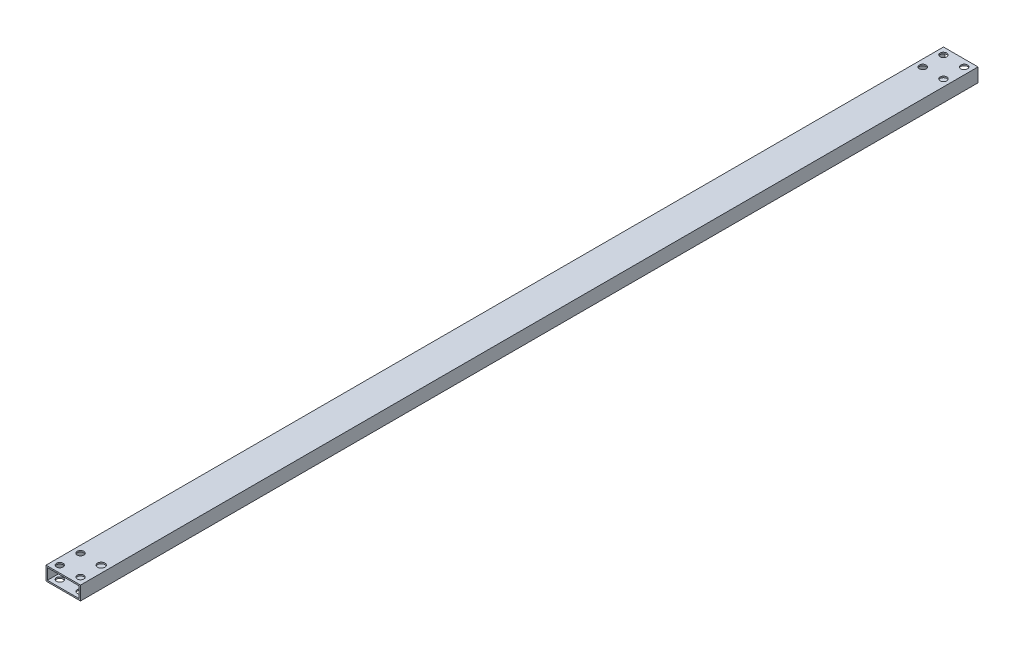
ISO-10303-21;
HEADER;
FILE_DESCRIPTION(('STEP AP214'),'2;1');
FILE_NAME('part.step','',(''),(''),'','','');
FILE_SCHEMA(('AUTOMOTIVE_DESIGN { 1 0 10303 214 1 1 1 1 }'));
ENDSEC;
DATA;
#1=APPLICATION_CONTEXT('core data for automotive mechanical design processes');
#2=APPLICATION_PROTOCOL_DEFINITION('international standard','automotive_design',2000,#1);
#3=PRODUCT_CONTEXT('',#1,'mechanical');
#4=PRODUCT('Part','Part','',(#3));
#5=PRODUCT_RELATED_PRODUCT_CATEGORY('part','',(#4));
#6=PRODUCT_DEFINITION_FORMATION('','',#4);
#7=PRODUCT_DEFINITION_CONTEXT('part definition',#1,'design');
#8=PRODUCT_DEFINITION('design','',#6,#7);
#9=PRODUCT_DEFINITION_SHAPE('','',#8);
#10=(LENGTH_UNIT() NAMED_UNIT(*) SI_UNIT(.MILLI.,.METRE.));
#11=(NAMED_UNIT(*) PLANE_ANGLE_UNIT() SI_UNIT($,.RADIAN.));
#12=(NAMED_UNIT(*) SI_UNIT($,.STERADIAN.) SOLID_ANGLE_UNIT());
#13=UNCERTAINTY_MEASURE_WITH_UNIT(LENGTH_MEASURE(1.E-05),#10,'distance_accuracy_value','');
#14=(GEOMETRIC_REPRESENTATION_CONTEXT(3) GLOBAL_UNCERTAINTY_ASSIGNED_CONTEXT((#13)) GLOBAL_UNIT_ASSIGNED_CONTEXT((#10,
#11,#12)) REPRESENTATION_CONTEXT('',''));
#15=CARTESIAN_POINT('',(0.,0.,0.));
#16=DIRECTION('',(0.,0.,1.));
#17=DIRECTION('',(1.,0.,0.));
#18=AXIS2_PLACEMENT_3D('',#15,#16,#17);
#19=CARTESIAN_POINT('',(25.,-10.,1300.));
#20=DIRECTION('',(-1.,0.,0.));
#21=DIRECTION('',(0.,0.,1.));
#22=AXIS2_PLACEMENT_3D('',#19,#20,#21);
#23=PLANE('',#22);
#24=DIRECTION('',(0.,1.,0.));
#25=VECTOR('',#24,1.);
#26=CARTESIAN_POINT('',(25.,-10.,0.));
#27=LINE('',#26,#25);
#28=CARTESIAN_POINT('',(25.,-10.,0.));
#29=VERTEX_POINT('',#28);
#30=CARTESIAN_POINT('',(25.,10.,0.));
#31=VERTEX_POINT('',#30);
#32=EDGE_CURVE('E135',#29,#31,#27,.T.);
#33=ORIENTED_EDGE('',*,*,#32,.T.);
#34=DIRECTION('',(0.,0.,-1.));
#35=VECTOR('',#34,1.);
#36=CARTESIAN_POINT('',(25.,10.,1300.));
#37=LINE('',#36,#35);
#38=CARTESIAN_POINT('',(25.,10.,1300.));
#39=VERTEX_POINT('',#38);
#40=EDGE_CURVE('E11',#39,#31,#37,.T.);
#41=ORIENTED_EDGE('',*,*,#40,.F.);
#42=DIRECTION('',(0.,1.,0.));
#43=VECTOR('',#42,1.);
#44=CARTESIAN_POINT('',(25.,-10.,1300.));
#45=LINE('',#44,#43);
#46=CARTESIAN_POINT('',(25.,-10.,1300.));
#47=VERTEX_POINT('',#46);
#48=EDGE_CURVE('E139',#47,#39,#45,.T.);
#49=ORIENTED_EDGE('',*,*,#48,.F.);
#50=DIRECTION('',(0.,0.,-1.));
#51=VECTOR('',#50,1.);
#52=CARTESIAN_POINT('',(25.,-10.,1300.));
#53=LINE('',#52,#51);
#54=EDGE_CURVE('E149',#47,#29,#53,.T.);
#55=ORIENTED_EDGE('',*,*,#54,.T.);
#56=EDGE_LOOP('',(#33,#41,#49,#55));
#57=FACE_BOUND('',#56,.T.);
#58=ADVANCED_FACE('F33',(#57),#23,.F.);
#59=CARTESIAN_POINT('',(-25.,10.,1300.));
#60=DIRECTION('',(0.,-1.,0.));
#61=DIRECTION('',(0.,0.,-1.));
#62=AXIS2_PLACEMENT_3D('',#59,#60,#61);
#63=PLANE('',#62);
#64=CARTESIAN_POINT('',(15.,10.,1290.));
#65=DIRECTION('',(0.,1.,0.));
#66=DIRECTION('',(0.,0.,1.));
#67=AXIS2_PLACEMENT_3D('',#64,#65,#66);
#68=CIRCLE('',#67,4.80233269000457);
#69=CARTESIAN_POINT('',(15.,10.,1294.80233269));
#70=VERTEX_POINT('',#69);
#71=EDGE_CURVE('E513',#70,#70,#68,.T.);
#72=ORIENTED_EDGE('',*,*,#71,.F.);
#73=EDGE_LOOP('',(#72));
#74=FACE_BOUND('',#73,.T.);
#75=CARTESIAN_POINT('',(-15.0000000000001,10.,1290.));
#76=DIRECTION('',(0.,1.,0.));
#77=DIRECTION('',(0.,0.,1.));
#78=AXIS2_PLACEMENT_3D('',#75,#76,#77);
#79=CIRCLE('',#78,4.78719116511338);
#80=CARTESIAN_POINT('',(-15.0000000000001,10.,1294.78719116511));
#81=VERTEX_POINT('',#80);
#82=EDGE_CURVE('E202',#81,#81,#79,.T.);
#83=ORIENTED_EDGE('',*,*,#82,.F.);
#84=EDGE_LOOP('',(#83));
#85=FACE_BOUND('',#84,.T.);
#86=CARTESIAN_POINT('',(-15.,10.,1260.));
#87=DIRECTION('',(0.,1.,0.));
#88=DIRECTION('',(0.,0.,1.));
#89=AXIS2_PLACEMENT_3D('',#86,#87,#88);
#90=CIRCLE('',#89,4.87079540304988);
#91=CARTESIAN_POINT('',(-15.,10.,1264.87079540305));
#92=VERTEX_POINT('',#91);
#93=EDGE_CURVE('E199',#92,#92,#90,.T.);
#94=ORIENTED_EDGE('',*,*,#93,.F.);
#95=EDGE_LOOP('',(#94));
#96=FACE_BOUND('',#95,.T.);
#97=CARTESIAN_POINT('',(14.9999999999999,10.,1260.));
#98=DIRECTION('',(0.,1.,0.));
#99=DIRECTION('',(0.,0.,1.));
#100=AXIS2_PLACEMENT_3D('',#97,#98,#99);
#101=CIRCLE('',#100,5.29030637475296);
#102=CARTESIAN_POINT('',(14.9999999999999,10.,1265.29030637475));
#103=VERTEX_POINT('',#102);
#104=EDGE_CURVE('E218',#103,#103,#101,.T.);
#105=ORIENTED_EDGE('',*,*,#104,.F.);
#106=EDGE_LOOP('',(#105));
#107=FACE_BOUND('',#106,.T.);
#108=CARTESIAN_POINT('',(-15.,10.,40.));
#109=DIRECTION('',(0.,1.,0.));
#110=DIRECTION('',(0.,0.,1.));
#111=AXIS2_PLACEMENT_3D('',#108,#109,#110);
#112=CIRCLE('',#111,4.87079540304988);
#113=CARTESIAN_POINT('',(-15.,10.,44.8707954030499));
#114=VERTEX_POINT('',#113);
#115=EDGE_CURVE('E225',#114,#114,#112,.T.);
#116=ORIENTED_EDGE('',*,*,#115,.F.);
#117=EDGE_LOOP('',(#116));
#118=FACE_BOUND('',#117,.T.);
#119=CARTESIAN_POINT('',(15.,10.,40.));
#120=DIRECTION('',(0.,1.,0.));
#121=DIRECTION('',(0.,0.,1.));
#122=AXIS2_PLACEMENT_3D('',#119,#120,#121);
#123=CIRCLE('',#122,4.87079540304988);
#124=CARTESIAN_POINT('',(15.,10.,44.8707954030499));
#125=VERTEX_POINT('',#124);
#126=EDGE_CURVE('E232',#125,#125,#123,.T.);
#127=ORIENTED_EDGE('',*,*,#126,.F.);
#128=EDGE_LOOP('',(#127));
#129=FACE_BOUND('',#128,.T.);
#130=CARTESIAN_POINT('',(15.,10.,10.));
#131=DIRECTION('',(0.,1.,0.));
#132=DIRECTION('',(0.,0.,1.));
#133=AXIS2_PLACEMENT_3D('',#130,#131,#132);
#134=CIRCLE('',#133,4.87079540304988);
#135=CARTESIAN_POINT('',(15.,10.,14.8707954030499));
#136=VERTEX_POINT('',#135);
#137=EDGE_CURVE('E239',#136,#136,#134,.T.);
#138=ORIENTED_EDGE('',*,*,#137,.F.);
#139=EDGE_LOOP('',(#138));
#140=FACE_BOUND('',#139,.T.);
#141=CARTESIAN_POINT('',(-15.,10.,10.));
#142=DIRECTION('',(0.,1.,0.));
#143=DIRECTION('',(0.,0.,1.));
#144=AXIS2_PLACEMENT_3D('',#141,#142,#143);
#145=CIRCLE('',#144,4.87079540304988);
#146=CARTESIAN_POINT('',(-15.,10.,14.8707954030499));
#147=VERTEX_POINT('',#146);
#148=EDGE_CURVE('E246',#147,#147,#145,.T.);
#149=ORIENTED_EDGE('',*,*,#148,.F.);
#150=EDGE_LOOP('',(#149));
#151=FACE_BOUND('',#150,.T.);
#152=DIRECTION('',(-1.,0.,0.));
#153=VECTOR('',#152,1.);
#154=CARTESIAN_POINT('',(-25.,10.,0.));
#155=LINE('',#154,#153);
#156=CARTESIAN_POINT('',(-25.,10.,0.));
#157=VERTEX_POINT('',#156);
#158=EDGE_CURVE('E152',#31,#157,#155,.T.);
#159=ORIENTED_EDGE('',*,*,#158,.T.);
#160=DIRECTION('',(0.,0.,-1.));
#161=VECTOR('',#160,1.);
#162=CARTESIAN_POINT('',(-25.,10.,1300.));
#163=LINE('',#162,#161);
#164=CARTESIAN_POINT('',(-25.,10.,1300.));
#165=VERTEX_POINT('',#164);
#166=EDGE_CURVE('E41',#165,#157,#163,.T.);
#167=ORIENTED_EDGE('',*,*,#166,.F.);
#168=DIRECTION('',(-1.,0.,0.));
#169=VECTOR('',#168,1.);
#170=CARTESIAN_POINT('',(-25.,10.,1300.));
#171=LINE('',#170,#169);
#172=EDGE_CURVE('E142',#39,#165,#171,.T.);
#173=ORIENTED_EDGE('',*,*,#172,.F.);
#174=ORIENTED_EDGE('',*,*,#40,.T.);
#175=EDGE_LOOP('',(#159,#167,#173,#174));
#176=FACE_BOUND('',#175,.T.);
#177=ADVANCED_FACE('F254',(#74,#85,#96,#107,#118,#129,#140,#151,#176),#63,.F.);
#178=CARTESIAN_POINT('',(-25.,-10.,1300.));
#179=DIRECTION('',(1.,0.,0.));
#180=DIRECTION('',(0.,0.,-1.));
#181=AXIS2_PLACEMENT_3D('',#178,#179,#180);
#182=PLANE('',#181);
#183=DIRECTION('',(0.,-1.,0.));
#184=VECTOR('',#183,1.);
#185=CARTESIAN_POINT('',(-25.,-10.,0.));
#186=LINE('',#185,#184);
#187=CARTESIAN_POINT('',(-25.,-10.,0.));
#188=VERTEX_POINT('',#187);
#189=EDGE_CURVE('E154',#157,#188,#186,.T.);
#190=ORIENTED_EDGE('',*,*,#189,.T.);
#191=DIRECTION('',(0.,0.,-1.));
#192=VECTOR('',#191,1.);
#193=CARTESIAN_POINT('',(-25.,-10.,1300.));
#194=LINE('',#193,#192);
#195=CARTESIAN_POINT('',(-25.,-10.,1300.));
#196=VERTEX_POINT('',#195);
#197=EDGE_CURVE('E159',#196,#188,#194,.T.);
#198=ORIENTED_EDGE('',*,*,#197,.F.);
#199=DIRECTION('',(0.,-1.,0.));
#200=VECTOR('',#199,1.);
#201=CARTESIAN_POINT('',(-25.,-10.,1300.));
#202=LINE('',#201,#200);
#203=EDGE_CURVE('E145',#165,#196,#202,.T.);
#204=ORIENTED_EDGE('',*,*,#203,.F.);
#205=ORIENTED_EDGE('',*,*,#166,.T.);
#206=EDGE_LOOP('',(#190,#198,#204,#205));
#207=FACE_BOUND('',#206,.T.);
#208=ADVANCED_FACE('F257',(#207),#182,.F.);
#209=CARTESIAN_POINT('',(-25.,-10.,1300.));
#210=DIRECTION('',(0.,1.,0.));
#211=DIRECTION('',(0.,0.,1.));
#212=AXIS2_PLACEMENT_3D('',#209,#210,#211);
#213=PLANE('',#212);
#214=CARTESIAN_POINT('',(15.,-10.,1290.));
#215=DIRECTION('',(0.,1.,0.));
#216=DIRECTION('',(0.,0.,1.));
#217=AXIS2_PLACEMENT_3D('',#214,#215,#216);
#218=CIRCLE('',#217,4.80233269000457);
#219=CARTESIAN_POINT('',(15.,-10.,1294.80233269));
#220=VERTEX_POINT('',#219);
#221=EDGE_CURVE('E508',#220,#220,#218,.T.);
#222=ORIENTED_EDGE('',*,*,#221,.T.);
#223=EDGE_LOOP('',(#222));
#224=FACE_BOUND('',#223,.T.);
#225=CARTESIAN_POINT('',(-15.0000000000001,-10.,1290.));
#226=DIRECTION('',(0.,1.,0.));
#227=DIRECTION('',(0.,0.,1.));
#228=AXIS2_PLACEMENT_3D('',#225,#226,#227);
#229=CIRCLE('',#228,4.78719116511338);
#230=CARTESIAN_POINT('',(-15.0000000000001,-10.,1294.78719116511));
#231=VERTEX_POINT('',#230);
#232=EDGE_CURVE('E195',#231,#231,#229,.T.);
#233=ORIENTED_EDGE('',*,*,#232,.T.);
#234=EDGE_LOOP('',(#233));
#235=FACE_BOUND('',#234,.T.);
#236=CARTESIAN_POINT('',(-15.,-10.,1260.));
#237=DIRECTION('',(0.,1.,0.));
#238=DIRECTION('',(0.,0.,1.));
#239=AXIS2_PLACEMENT_3D('',#236,#237,#238);
#240=CIRCLE('',#239,4.87079540304988);
#241=CARTESIAN_POINT('',(-15.,-10.,1264.87079540305));
#242=VERTEX_POINT('',#241);
#243=EDGE_CURVE('E191',#242,#242,#240,.T.);
#244=ORIENTED_EDGE('',*,*,#243,.T.);
#245=EDGE_LOOP('',(#244));
#246=FACE_BOUND('',#245,.T.);
#247=CARTESIAN_POINT('',(14.9999999999999,-10.,1260.));
#248=DIRECTION('',(0.,1.,0.));
#249=DIRECTION('',(0.,0.,1.));
#250=AXIS2_PLACEMENT_3D('',#247,#248,#249);
#251=CIRCLE('',#250,5.29030637475296);
#252=CARTESIAN_POINT('',(14.9999999999999,-10.,1265.29030637475));
#253=VERTEX_POINT('',#252);
#254=EDGE_CURVE('E187',#253,#253,#251,.T.);
#255=ORIENTED_EDGE('',*,*,#254,.T.);
#256=EDGE_LOOP('',(#255));
#257=FACE_BOUND('',#256,.T.);
#258=CARTESIAN_POINT('',(-15.,-10.,40.));
#259=DIRECTION('',(0.,1.,0.));
#260=DIRECTION('',(0.,0.,1.));
#261=AXIS2_PLACEMENT_3D('',#258,#259,#260);
#262=CIRCLE('',#261,4.87079540304988);
#263=CARTESIAN_POINT('',(-15.,-10.,44.8707954030499));
#264=VERTEX_POINT('',#263);
#265=EDGE_CURVE('E182',#264,#264,#262,.T.);
#266=ORIENTED_EDGE('',*,*,#265,.T.);
#267=EDGE_LOOP('',(#266));
#268=FACE_BOUND('',#267,.T.);
#269=CARTESIAN_POINT('',(15.,-10.,40.));
#270=DIRECTION('',(0.,1.,0.));
#271=DIRECTION('',(0.,0.,1.));
#272=AXIS2_PLACEMENT_3D('',#269,#270,#271);
#273=CIRCLE('',#272,4.87079540304988);
#274=CARTESIAN_POINT('',(15.,-10.,44.8707954030499));
#275=VERTEX_POINT('',#274);
#276=EDGE_CURVE('E177',#275,#275,#273,.T.);
#277=ORIENTED_EDGE('',*,*,#276,.T.);
#278=EDGE_LOOP('',(#277));
#279=FACE_BOUND('',#278,.T.);
#280=CARTESIAN_POINT('',(15.,-10.,10.));
#281=DIRECTION('',(0.,1.,0.));
#282=DIRECTION('',(0.,0.,1.));
#283=AXIS2_PLACEMENT_3D('',#280,#281,#282);
#284=CIRCLE('',#283,4.87079540304988);
#285=CARTESIAN_POINT('',(15.,-10.,14.8707954030499));
#286=VERTEX_POINT('',#285);
#287=EDGE_CURVE('E172',#286,#286,#284,.T.);
#288=ORIENTED_EDGE('',*,*,#287,.T.);
#289=EDGE_LOOP('',(#288));
#290=FACE_BOUND('',#289,.T.);
#291=CARTESIAN_POINT('',(-15.,-10.,10.));
#292=DIRECTION('',(0.,1.,0.));
#293=DIRECTION('',(0.,0.,1.));
#294=AXIS2_PLACEMENT_3D('',#291,#292,#293);
#295=CIRCLE('',#294,4.87079540304988);
#296=CARTESIAN_POINT('',(-15.,-10.,14.8707954030499));
#297=VERTEX_POINT('',#296);
#298=EDGE_CURVE('E167',#297,#297,#295,.T.);
#299=ORIENTED_EDGE('',*,*,#298,.T.);
#300=EDGE_LOOP('',(#299));
#301=FACE_BOUND('',#300,.T.);
#302=DIRECTION('',(1.,0.,0.));
#303=VECTOR('',#302,1.);
#304=CARTESIAN_POINT('',(-25.,-10.,0.));
#305=LINE('',#304,#303);
#306=EDGE_CURVE('E143',#188,#29,#305,.T.);
#307=ORIENTED_EDGE('',*,*,#306,.T.);
#308=ORIENTED_EDGE('',*,*,#54,.F.);
#309=DIRECTION('',(1.,0.,0.));
#310=VECTOR('',#309,1.);
#311=CARTESIAN_POINT('',(-25.,-10.,1300.));
#312=LINE('',#311,#310);
#313=EDGE_CURVE('E147',#196,#47,#312,.T.);
#314=ORIENTED_EDGE('',*,*,#313,.F.);
#315=ORIENTED_EDGE('',*,*,#197,.T.);
#316=EDGE_LOOP('',(#307,#308,#314,#315));
#317=FACE_BOUND('',#316,.T.);
#318=ADVANCED_FACE('F269',(#224,#235,#246,#257,#268,#279,#290,#301,#317),#213,.F.);
#319=CARTESIAN_POINT('',(25.,10.,1300.));
#320=DIRECTION('',(0.,0.,-1.));
#321=DIRECTION('',(-1.,0.,0.));
#322=AXIS2_PLACEMENT_3D('',#319,#320,#321);
#323=PLANE('',#322);
#324=DIRECTION('',(-1.,0.,0.));
#325=VECTOR('',#324,1.);
#326=CARTESIAN_POINT('',(-23.,8.,1300.));
#327=LINE('',#326,#325);
#328=CARTESIAN_POINT('',(23.,8.,1300.));
#329=VERTEX_POINT('',#328);
#330=CARTESIAN_POINT('',(-23.,8.,1300.));
#331=VERTEX_POINT('',#330);
#332=EDGE_CURVE('E129',#329,#331,#327,.T.);
#333=ORIENTED_EDGE('',*,*,#332,.F.);
#334=DIRECTION('',(0.,1.,0.));
#335=VECTOR('',#334,1.);
#336=CARTESIAN_POINT('',(23.,-8.,1300.));
#337=LINE('',#336,#335);
#338=CARTESIAN_POINT('',(23.,-8.,1300.));
#339=VERTEX_POINT('',#338);
#340=EDGE_CURVE('E49',#339,#329,#337,.T.);
#341=ORIENTED_EDGE('',*,*,#340,.F.);
#342=DIRECTION('',(1.,0.,0.));
#343=VECTOR('',#342,1.);
#344=CARTESIAN_POINT('',(-23.,-8.,1300.));
#345=LINE('',#344,#343);
#346=CARTESIAN_POINT('',(-23.,-8.,1300.));
#347=VERTEX_POINT('',#346);
#348=EDGE_CURVE('E117',#347,#339,#345,.T.);
#349=ORIENTED_EDGE('',*,*,#348,.F.);
#350=DIRECTION('',(0.,-1.,0.));
#351=VECTOR('',#350,1.);
#352=CARTESIAN_POINT('',(-23.,-8.,1300.));
#353=LINE('',#352,#351);
#354=EDGE_CURVE('E120',#331,#347,#353,.T.);
#355=ORIENTED_EDGE('',*,*,#354,.F.);
#356=EDGE_LOOP('',(#333,#341,#349,#355));
#357=FACE_BOUND('',#356,.T.);
#358=ORIENTED_EDGE('',*,*,#48,.T.);
#359=ORIENTED_EDGE('',*,*,#172,.T.);
#360=ORIENTED_EDGE('',*,*,#203,.T.);
#361=ORIENTED_EDGE('',*,*,#313,.T.);
#362=EDGE_LOOP('',(#358,#359,#360,#361));
#363=FACE_BOUND('',#362,.T.);
#364=ADVANCED_FACE('F274',(#357,#363),#323,.F.);
#365=CARTESIAN_POINT('',(25.,10.,0.));
#366=DIRECTION('',(0.,0.,-1.));
#367=DIRECTION('',(-1.,0.,0.));
#368=AXIS2_PLACEMENT_3D('',#365,#366,#367);
#369=PLANE('',#368);
#370=DIRECTION('',(0.,1.,0.));
#371=VECTOR('',#370,1.);
#372=CARTESIAN_POINT('',(23.,-8.,0.));
#373=LINE('',#372,#371);
#374=CARTESIAN_POINT('',(23.,-8.,0.));
#375=VERTEX_POINT('',#374);
#376=CARTESIAN_POINT('',(23.,8.,0.));
#377=VERTEX_POINT('',#376);
#378=EDGE_CURVE('E101',#375,#377,#373,.T.);
#379=ORIENTED_EDGE('',*,*,#378,.T.);
#380=DIRECTION('',(-1.,0.,0.));
#381=VECTOR('',#380,1.);
#382=CARTESIAN_POINT('',(-23.,8.,0.));
#383=LINE('',#382,#381);
#384=CARTESIAN_POINT('',(-23.,8.,0.));
#385=VERTEX_POINT('',#384);
#386=EDGE_CURVE('E110',#377,#385,#383,.T.);
#387=ORIENTED_EDGE('',*,*,#386,.T.);
#388=DIRECTION('',(0.,-1.,0.));
#389=VECTOR('',#388,1.);
#390=CARTESIAN_POINT('',(-23.,-8.,0.));
#391=LINE('',#390,#389);
#392=CARTESIAN_POINT('',(-23.,-8.,0.));
#393=VERTEX_POINT('',#392);
#394=EDGE_CURVE('E57',#385,#393,#391,.T.);
#395=ORIENTED_EDGE('',*,*,#394,.T.);
#396=DIRECTION('',(1.,0.,0.));
#397=VECTOR('',#396,1.);
#398=CARTESIAN_POINT('',(-23.,-8.,0.));
#399=LINE('',#398,#397);
#400=EDGE_CURVE('E107',#393,#375,#399,.T.);
#401=ORIENTED_EDGE('',*,*,#400,.T.);
#402=EDGE_LOOP('',(#379,#387,#395,#401));
#403=FACE_BOUND('',#402,.T.);
#404=ORIENTED_EDGE('',*,*,#32,.F.);
#405=ORIENTED_EDGE('',*,*,#306,.F.);
#406=ORIENTED_EDGE('',*,*,#189,.F.);
#407=ORIENTED_EDGE('',*,*,#158,.F.);
#408=EDGE_LOOP('',(#404,#405,#406,#407));
#409=FACE_BOUND('',#408,.T.);
#410=ADVANCED_FACE('F114',(#403,#409),#369,.T.);
#411=CARTESIAN_POINT('',(23.,-8.,0.));
#412=DIRECTION('',(1.,0.,0.));
#413=DIRECTION('',(0.,0.,-1.));
#414=AXIS2_PLACEMENT_3D('',#411,#412,#413);
#415=PLANE('',#414);
#416=ORIENTED_EDGE('',*,*,#340,.T.);
#417=DIRECTION('',(0.,0.,1.));
#418=VECTOR('',#417,1.);
#419=CARTESIAN_POINT('',(23.,8.,0.));
#420=LINE('',#419,#418);
#421=EDGE_CURVE('E97',#377,#329,#420,.T.);
#422=ORIENTED_EDGE('',*,*,#421,.F.);
#423=ORIENTED_EDGE('',*,*,#378,.F.);
#424=DIRECTION('',(0.,0.,1.));
#425=VECTOR('',#424,1.);
#426=CARTESIAN_POINT('',(23.,-8.,0.));
#427=LINE('',#426,#425);
#428=EDGE_CURVE('E133',#375,#339,#427,.T.);
#429=ORIENTED_EDGE('',*,*,#428,.T.);
#430=EDGE_LOOP('',(#416,#422,#423,#429));
#431=FACE_BOUND('',#430,.T.);
#432=ADVANCED_FACE('F99',(#431),#415,.F.);
#433=CARTESIAN_POINT('',(-23.,-8.,0.));
#434=DIRECTION('',(0.,-1.,0.));
#435=DIRECTION('',(0.,0.,-1.));
#436=AXIS2_PLACEMENT_3D('',#433,#434,#435);
#437=PLANE('',#436);
#438=CARTESIAN_POINT('',(15.,-8.,1290.));
#439=DIRECTION('',(0.,-1.,0.));
#440=DIRECTION('',(0.,0.,-1.));
#441=AXIS2_PLACEMENT_3D('',#438,#439,#440);
#442=CIRCLE('',#441,4.80233269000457);
#443=CARTESIAN_POINT('',(15.,-8.,1285.19766731));
#444=VERTEX_POINT('',#443);
#445=EDGE_CURVE('E207',#444,#444,#442,.T.);
#446=ORIENTED_EDGE('',*,*,#445,.T.);
#447=EDGE_LOOP('',(#446));
#448=FACE_BOUND('',#447,.T.);
#449=CARTESIAN_POINT('',(-15.0000000000001,-8.,1290.));
#450=DIRECTION('',(0.,-1.,0.));
#451=DIRECTION('',(0.,0.,-1.));
#452=AXIS2_PLACEMENT_3D('',#449,#450,#451);
#453=CIRCLE('',#452,4.78719116511338);
#454=CARTESIAN_POINT('',(-15.0000000000001,-8.,1285.21280883489));
#455=VERTEX_POINT('',#454);
#456=EDGE_CURVE('E194',#455,#455,#453,.T.);
#457=ORIENTED_EDGE('',*,*,#456,.T.);
#458=EDGE_LOOP('',(#457));
#459=FACE_BOUND('',#458,.T.);
#460=CARTESIAN_POINT('',(-15.,-8.,1260.));
#461=DIRECTION('',(0.,-1.,0.));
#462=DIRECTION('',(0.,0.,-1.));
#463=AXIS2_PLACEMENT_3D('',#460,#461,#462);
#464=CIRCLE('',#463,4.87079540304988);
#465=CARTESIAN_POINT('',(-15.,-8.,1255.12920459695));
#466=VERTEX_POINT('',#465);
#467=EDGE_CURVE('E190',#466,#466,#464,.T.);
#468=ORIENTED_EDGE('',*,*,#467,.T.);
#469=EDGE_LOOP('',(#468));
#470=FACE_BOUND('',#469,.T.);
#471=CARTESIAN_POINT('',(14.9999999999999,-8.,1260.));
#472=DIRECTION('',(0.,-1.,0.));
#473=DIRECTION('',(0.,0.,-1.));
#474=AXIS2_PLACEMENT_3D('',#471,#472,#473);
#475=CIRCLE('',#474,5.29030637475296);
#476=CARTESIAN_POINT('',(14.9999999999999,-8.,1254.70969362525));
#477=VERTEX_POINT('',#476);
#478=EDGE_CURVE('E186',#477,#477,#475,.T.);
#479=ORIENTED_EDGE('',*,*,#478,.T.);
#480=EDGE_LOOP('',(#479));
#481=FACE_BOUND('',#480,.T.);
#482=CARTESIAN_POINT('',(-15.,-8.,40.));
#483=DIRECTION('',(0.,-1.,0.));
#484=DIRECTION('',(0.,0.,-1.));
#485=AXIS2_PLACEMENT_3D('',#482,#483,#484);
#486=CIRCLE('',#485,4.87079540304988);
#487=CARTESIAN_POINT('',(-15.,-8.,35.1292045969501));
#488=VERTEX_POINT('',#487);
#489=EDGE_CURVE('E181',#488,#488,#486,.T.);
#490=ORIENTED_EDGE('',*,*,#489,.T.);
#491=EDGE_LOOP('',(#490));
#492=FACE_BOUND('',#491,.T.);
#493=CARTESIAN_POINT('',(15.,-8.,40.));
#494=DIRECTION('',(0.,-1.,0.));
#495=DIRECTION('',(0.,0.,-1.));
#496=AXIS2_PLACEMENT_3D('',#493,#494,#495);
#497=CIRCLE('',#496,4.87079540304988);
#498=CARTESIAN_POINT('',(15.,-8.,35.1292045969501));
#499=VERTEX_POINT('',#498);
#500=EDGE_CURVE('E176',#499,#499,#497,.T.);
#501=ORIENTED_EDGE('',*,*,#500,.T.);
#502=EDGE_LOOP('',(#501));
#503=FACE_BOUND('',#502,.T.);
#504=CARTESIAN_POINT('',(15.,-8.,10.));
#505=DIRECTION('',(0.,-1.,0.));
#506=DIRECTION('',(0.,0.,-1.));
#507=AXIS2_PLACEMENT_3D('',#504,#505,#506);
#508=CIRCLE('',#507,4.87079540304988);
#509=CARTESIAN_POINT('',(15.,-8.,5.12920459695013));
#510=VERTEX_POINT('',#509);
#511=EDGE_CURVE('E171',#510,#510,#508,.T.);
#512=ORIENTED_EDGE('',*,*,#511,.T.);
#513=EDGE_LOOP('',(#512));
#514=FACE_BOUND('',#513,.T.);
#515=CARTESIAN_POINT('',(-15.,-8.,10.));
#516=DIRECTION('',(0.,-1.,0.));
#517=DIRECTION('',(0.,0.,-1.));
#518=AXIS2_PLACEMENT_3D('',#515,#516,#517);
#519=CIRCLE('',#518,4.87079540304988);
#520=CARTESIAN_POINT('',(-15.,-8.,5.12920459695013));
#521=VERTEX_POINT('',#520);
#522=EDGE_CURVE('E123',#521,#521,#519,.T.);
#523=ORIENTED_EDGE('',*,*,#522,.T.);
#524=EDGE_LOOP('',(#523));
#525=FACE_BOUND('',#524,.T.);
#526=ORIENTED_EDGE('',*,*,#348,.T.);
#527=ORIENTED_EDGE('',*,*,#428,.F.);
#528=ORIENTED_EDGE('',*,*,#400,.F.);
#529=DIRECTION('',(0.,0.,1.));
#530=VECTOR('',#529,1.);
#531=CARTESIAN_POINT('',(-23.,-8.,0.));
#532=LINE('',#531,#530);
#533=EDGE_CURVE('E136',#393,#347,#532,.T.);
#534=ORIENTED_EDGE('',*,*,#533,.T.);
#535=EDGE_LOOP('',(#526,#527,#528,#534));
#536=FACE_BOUND('',#535,.T.);
#537=ADVANCED_FACE('F310',(#448,#459,#470,#481,#492,#503,#514,#525,#536),#437,.F.);
#538=CARTESIAN_POINT('',(-23.,-8.,0.));
#539=DIRECTION('',(-1.,0.,0.));
#540=DIRECTION('',(0.,0.,1.));
#541=AXIS2_PLACEMENT_3D('',#538,#539,#540);
#542=PLANE('',#541);
#543=ORIENTED_EDGE('',*,*,#354,.T.);
#544=ORIENTED_EDGE('',*,*,#533,.F.);
#545=ORIENTED_EDGE('',*,*,#394,.F.);
#546=DIRECTION('',(0.,0.,1.));
#547=VECTOR('',#546,1.);
#548=CARTESIAN_POINT('',(-23.,8.,0.));
#549=LINE('',#548,#547);
#550=EDGE_CURVE('E106',#385,#331,#549,.T.);
#551=ORIENTED_EDGE('',*,*,#550,.T.);
#552=EDGE_LOOP('',(#543,#544,#545,#551));
#553=FACE_BOUND('',#552,.T.);
#554=ADVANCED_FACE('F315',(#553),#542,.F.);
#555=CARTESIAN_POINT('',(-23.,8.,0.));
#556=DIRECTION('',(0.,1.,0.));
#557=DIRECTION('',(0.,0.,1.));
#558=AXIS2_PLACEMENT_3D('',#555,#556,#557);
#559=PLANE('',#558);
#560=CARTESIAN_POINT('',(15.,8.,1290.));
#561=DIRECTION('',(0.,1.,0.));
#562=DIRECTION('',(0.,0.,1.));
#563=AXIS2_PLACEMENT_3D('',#560,#561,#562);
#564=CIRCLE('',#563,4.80233269000457);
#565=CARTESIAN_POINT('',(15.,8.,1294.80233269));
#566=VERTEX_POINT('',#565);
#567=EDGE_CURVE('E36',#566,#566,#564,.T.);
#568=ORIENTED_EDGE('',*,*,#567,.T.);
#569=EDGE_LOOP('',(#568));
#570=FACE_BOUND('',#569,.T.);
#571=CARTESIAN_POINT('',(-15.0000000000001,8.,1290.));
#572=DIRECTION('',(0.,1.,0.));
#573=DIRECTION('',(0.,0.,1.));
#574=AXIS2_PLACEMENT_3D('',#571,#572,#573);
#575=CIRCLE('',#574,4.78719116511338);
#576=CARTESIAN_POINT('',(-15.0000000000001,8.,1294.78719116511));
#577=VERTEX_POINT('',#576);
#578=EDGE_CURVE('E192',#577,#577,#575,.T.);
#579=ORIENTED_EDGE('',*,*,#578,.T.);
#580=EDGE_LOOP('',(#579));
#581=FACE_BOUND('',#580,.T.);
#582=CARTESIAN_POINT('',(-15.,8.,1260.));
#583=DIRECTION('',(0.,1.,0.));
#584=DIRECTION('',(0.,0.,1.));
#585=AXIS2_PLACEMENT_3D('',#582,#583,#584);
#586=CIRCLE('',#585,4.87079540304988);
#587=CARTESIAN_POINT('',(-15.,8.,1264.87079540305));
#588=VERTEX_POINT('',#587);
#589=EDGE_CURVE('E188',#588,#588,#586,.T.);
#590=ORIENTED_EDGE('',*,*,#589,.T.);
#591=EDGE_LOOP('',(#590));
#592=FACE_BOUND('',#591,.T.);
#593=CARTESIAN_POINT('',(14.9999999999999,8.,1260.));
#594=DIRECTION('',(0.,1.,0.));
#595=DIRECTION('',(0.,0.,1.));
#596=AXIS2_PLACEMENT_3D('',#593,#594,#595);
#597=CIRCLE('',#596,5.29030637475296);
#598=CARTESIAN_POINT('',(14.9999999999999,8.,1265.29030637475));
#599=VERTEX_POINT('',#598);
#600=EDGE_CURVE('E183',#599,#599,#597,.T.);
#601=ORIENTED_EDGE('',*,*,#600,.T.);
#602=EDGE_LOOP('',(#601));
#603=FACE_BOUND('',#602,.T.);
#604=CARTESIAN_POINT('',(-15.,8.,40.));
#605=DIRECTION('',(0.,1.,0.));
#606=DIRECTION('',(0.,0.,1.));
#607=AXIS2_PLACEMENT_3D('',#604,#605,#606);
#608=CIRCLE('',#607,4.87079540304988);
#609=CARTESIAN_POINT('',(-15.,8.,44.8707954030499));
#610=VERTEX_POINT('',#609);
#611=EDGE_CURVE('E178',#610,#610,#608,.T.);
#612=ORIENTED_EDGE('',*,*,#611,.T.);
#613=EDGE_LOOP('',(#612));
#614=FACE_BOUND('',#613,.T.);
#615=CARTESIAN_POINT('',(15.,8.,40.));
#616=DIRECTION('',(0.,1.,0.));
#617=DIRECTION('',(0.,0.,1.));
#618=AXIS2_PLACEMENT_3D('',#615,#616,#617);
#619=CIRCLE('',#618,4.87079540304988);
#620=CARTESIAN_POINT('',(15.,8.,44.8707954030499));
#621=VERTEX_POINT('',#620);
#622=EDGE_CURVE('E173',#621,#621,#619,.T.);
#623=ORIENTED_EDGE('',*,*,#622,.T.);
#624=EDGE_LOOP('',(#623));
#625=FACE_BOUND('',#624,.T.);
#626=CARTESIAN_POINT('',(15.,8.,10.));
#627=DIRECTION('',(0.,1.,0.));
#628=DIRECTION('',(0.,0.,1.));
#629=AXIS2_PLACEMENT_3D('',#626,#627,#628);
#630=CIRCLE('',#629,4.87079540304988);
#631=CARTESIAN_POINT('',(15.,8.,14.8707954030499));
#632=VERTEX_POINT('',#631);
#633=EDGE_CURVE('E168',#632,#632,#630,.T.);
#634=ORIENTED_EDGE('',*,*,#633,.T.);
#635=EDGE_LOOP('',(#634));
#636=FACE_BOUND('',#635,.T.);
#637=CARTESIAN_POINT('',(-15.,8.,10.));
#638=DIRECTION('',(0.,1.,0.));
#639=DIRECTION('',(0.,0.,1.));
#640=AXIS2_PLACEMENT_3D('',#637,#638,#639);
#641=CIRCLE('',#640,4.87079540304988);
#642=CARTESIAN_POINT('',(-15.,8.,14.8707954030499));
#643=VERTEX_POINT('',#642);
#644=EDGE_CURVE('E164',#643,#643,#641,.T.);
#645=ORIENTED_EDGE('',*,*,#644,.T.);
#646=EDGE_LOOP('',(#645));
#647=FACE_BOUND('',#646,.T.);
#648=ORIENTED_EDGE('',*,*,#332,.T.);
#649=ORIENTED_EDGE('',*,*,#550,.F.);
#650=ORIENTED_EDGE('',*,*,#386,.F.);
#651=ORIENTED_EDGE('',*,*,#421,.T.);
#652=EDGE_LOOP('',(#648,#649,#650,#651));
#653=FACE_BOUND('',#652,.T.);
#654=ADVANCED_FACE('F111',(#570,#581,#592,#603,#614,#625,#636,#647,#653),#559,.F.);
#655=CARTESIAN_POINT('',(-15.,-10.,10.));
#656=DIRECTION('',(0.,1.,0.));
#657=DIRECTION('',(0.,0.,1.));
#658=AXIS2_PLACEMENT_3D('',#655,#656,#657);
#659=CYLINDRICAL_SURFACE('',#658,4.87079540304988);
#660=ORIENTED_EDGE('',*,*,#148,.T.);
#661=EDGE_LOOP('',(#660));
#662=FACE_BOUND('',#661,.T.);
#663=ORIENTED_EDGE('',*,*,#644,.F.);
#664=EDGE_LOOP('',(#663));
#665=FACE_BOUND('',#664,.T.);
#666=ADVANCED_FACE('F251',(#662,#665),#659,.F.);
#667=ORIENTED_EDGE('',*,*,#298,.F.);
#668=EDGE_LOOP('',(#667));
#669=FACE_BOUND('',#668,.T.);
#670=ORIENTED_EDGE('',*,*,#522,.F.);
#671=EDGE_LOOP('',(#670));
#672=FACE_BOUND('',#671,.T.);
#673=ADVANCED_FACE('F338',(#669,#672),#659,.F.);
#674=CARTESIAN_POINT('',(15.,-10.,10.));
#675=DIRECTION('',(0.,1.,0.));
#676=DIRECTION('',(0.,0.,1.));
#677=AXIS2_PLACEMENT_3D('',#674,#675,#676);
#678=CYLINDRICAL_SURFACE('',#677,4.87079540304988);
#679=ORIENTED_EDGE('',*,*,#137,.T.);
#680=EDGE_LOOP('',(#679));
#681=FACE_BOUND('',#680,.T.);
#682=ORIENTED_EDGE('',*,*,#633,.F.);
#683=EDGE_LOOP('',(#682));
#684=FACE_BOUND('',#683,.T.);
#685=ADVANCED_FACE('F347',(#681,#684),#678,.F.);
#686=ORIENTED_EDGE('',*,*,#287,.F.);
#687=EDGE_LOOP('',(#686));
#688=FACE_BOUND('',#687,.T.);
#689=ORIENTED_EDGE('',*,*,#511,.F.);
#690=EDGE_LOOP('',(#689));
#691=FACE_BOUND('',#690,.T.);
#692=ADVANCED_FACE('F356',(#688,#691),#678,.F.);
#693=CARTESIAN_POINT('',(15.,-10.,40.));
#694=DIRECTION('',(0.,1.,0.));
#695=DIRECTION('',(0.,0.,1.));
#696=AXIS2_PLACEMENT_3D('',#693,#694,#695);
#697=CYLINDRICAL_SURFACE('',#696,4.87079540304988);
#698=ORIENTED_EDGE('',*,*,#126,.T.);
#699=EDGE_LOOP('',(#698));
#700=FACE_BOUND('',#699,.T.);
#701=ORIENTED_EDGE('',*,*,#622,.F.);
#702=EDGE_LOOP('',(#701));
#703=FACE_BOUND('',#702,.T.);
#704=ADVANCED_FACE('F366',(#700,#703),#697,.F.);
#705=ORIENTED_EDGE('',*,*,#276,.F.);
#706=EDGE_LOOP('',(#705));
#707=FACE_BOUND('',#706,.T.);
#708=ORIENTED_EDGE('',*,*,#500,.F.);
#709=EDGE_LOOP('',(#708));
#710=FACE_BOUND('',#709,.T.);
#711=ADVANCED_FACE('F375',(#707,#710),#697,.F.);
#712=CARTESIAN_POINT('',(-15.,-10.,40.));
#713=DIRECTION('',(0.,1.,0.));
#714=DIRECTION('',(0.,0.,1.));
#715=AXIS2_PLACEMENT_3D('',#712,#713,#714);
#716=CYLINDRICAL_SURFACE('',#715,4.87079540304988);
#717=ORIENTED_EDGE('',*,*,#115,.T.);
#718=EDGE_LOOP('',(#717));
#719=FACE_BOUND('',#718,.T.);
#720=ORIENTED_EDGE('',*,*,#611,.F.);
#721=EDGE_LOOP('',(#720));
#722=FACE_BOUND('',#721,.T.);
#723=ADVANCED_FACE('F385',(#719,#722),#716,.F.);
#724=ORIENTED_EDGE('',*,*,#265,.F.);
#725=EDGE_LOOP('',(#724));
#726=FACE_BOUND('',#725,.T.);
#727=ORIENTED_EDGE('',*,*,#489,.F.);
#728=EDGE_LOOP('',(#727));
#729=FACE_BOUND('',#728,.T.);
#730=ADVANCED_FACE('F394',(#726,#729),#716,.F.);
#731=CARTESIAN_POINT('',(14.9999999999999,-10.,1260.));
#732=DIRECTION('',(0.,1.,0.));
#733=DIRECTION('',(0.,0.,1.));
#734=AXIS2_PLACEMENT_3D('',#731,#732,#733);
#735=CYLINDRICAL_SURFACE('',#734,5.29030637475296);
#736=ORIENTED_EDGE('',*,*,#104,.T.);
#737=EDGE_LOOP('',(#736));
#738=FACE_BOUND('',#737,.T.);
#739=ORIENTED_EDGE('',*,*,#600,.F.);
#740=EDGE_LOOP('',(#739));
#741=FACE_BOUND('',#740,.T.);
#742=ADVANCED_FACE('F404',(#738,#741),#735,.F.);
#743=ORIENTED_EDGE('',*,*,#254,.F.);
#744=EDGE_LOOP('',(#743));
#745=FACE_BOUND('',#744,.T.);
#746=ORIENTED_EDGE('',*,*,#478,.F.);
#747=EDGE_LOOP('',(#746));
#748=FACE_BOUND('',#747,.T.);
#749=ADVANCED_FACE('F413',(#745,#748),#735,.F.);
#750=CARTESIAN_POINT('',(-15.,-10.,1260.));
#751=DIRECTION('',(0.,1.,0.));
#752=DIRECTION('',(0.,0.,1.));
#753=AXIS2_PLACEMENT_3D('',#750,#751,#752);
#754=CYLINDRICAL_SURFACE('',#753,4.87079540304988);
#755=ORIENTED_EDGE('',*,*,#93,.T.);
#756=EDGE_LOOP('',(#755));
#757=FACE_BOUND('',#756,.T.);
#758=ORIENTED_EDGE('',*,*,#589,.F.);
#759=EDGE_LOOP('',(#758));
#760=FACE_BOUND('',#759,.T.);
#761=ADVANCED_FACE('F423',(#757,#760),#754,.F.);
#762=ORIENTED_EDGE('',*,*,#243,.F.);
#763=EDGE_LOOP('',(#762));
#764=FACE_BOUND('',#763,.T.);
#765=ORIENTED_EDGE('',*,*,#467,.F.);
#766=EDGE_LOOP('',(#765));
#767=FACE_BOUND('',#766,.T.);
#768=ADVANCED_FACE('F432',(#764,#767),#754,.F.);
#769=CARTESIAN_POINT('',(-15.0000000000001,-10.,1290.));
#770=DIRECTION('',(0.,1.,0.));
#771=DIRECTION('',(0.,0.,1.));
#772=AXIS2_PLACEMENT_3D('',#769,#770,#771);
#773=CYLINDRICAL_SURFACE('',#772,4.78719116511338);
#774=ORIENTED_EDGE('',*,*,#82,.T.);
#775=EDGE_LOOP('',(#774));
#776=FACE_BOUND('',#775,.T.);
#777=ORIENTED_EDGE('',*,*,#578,.F.);
#778=EDGE_LOOP('',(#777));
#779=FACE_BOUND('',#778,.T.);
#780=ADVANCED_FACE('F442',(#776,#779),#773,.F.);
#781=ORIENTED_EDGE('',*,*,#232,.F.);
#782=EDGE_LOOP('',(#781));
#783=FACE_BOUND('',#782,.T.);
#784=ORIENTED_EDGE('',*,*,#456,.F.);
#785=EDGE_LOOP('',(#784));
#786=FACE_BOUND('',#785,.T.);
#787=ADVANCED_FACE('F451',(#783,#786),#773,.F.);
#788=CARTESIAN_POINT('',(15.,-10.,1290.));
#789=DIRECTION('',(0.,1.,0.));
#790=DIRECTION('',(0.,0.,1.));
#791=AXIS2_PLACEMENT_3D('',#788,#789,#790);
#792=CYLINDRICAL_SURFACE('',#791,4.80233269000457);
#793=ORIENTED_EDGE('',*,*,#71,.T.);
#794=EDGE_LOOP('',(#793));
#795=FACE_BOUND('',#794,.T.);
#796=ORIENTED_EDGE('',*,*,#567,.F.);
#797=EDGE_LOOP('',(#796));
#798=FACE_BOUND('',#797,.T.);
#799=ADVANCED_FACE('F461',(#795,#798),#792,.F.);
#800=ORIENTED_EDGE('',*,*,#221,.F.);
#801=EDGE_LOOP('',(#800));
#802=FACE_BOUND('',#801,.T.);
#803=ORIENTED_EDGE('',*,*,#445,.F.);
#804=EDGE_LOOP('',(#803));
#805=FACE_BOUND('',#804,.T.);
#806=ADVANCED_FACE('F470',(#802,#805),#792,.F.);
#807=CLOSED_SHELL('',(#58,#177,#208,#318,#364,#410,#432,#537,#554,#654,#666,#673,#685,#692,#704,
#711,#723,#730,#742,#749,#761,#768,#780,#787,#799,#806));
#808=MANIFOLD_SOLID_BREP('B2',#807);
#809=ADVANCED_BREP_SHAPE_REPRESENTATION('',(#18,#808),#14);
#810=SHAPE_DEFINITION_REPRESENTATION(#9,#809);
ENDSEC;
END-ISO-10303-21;
